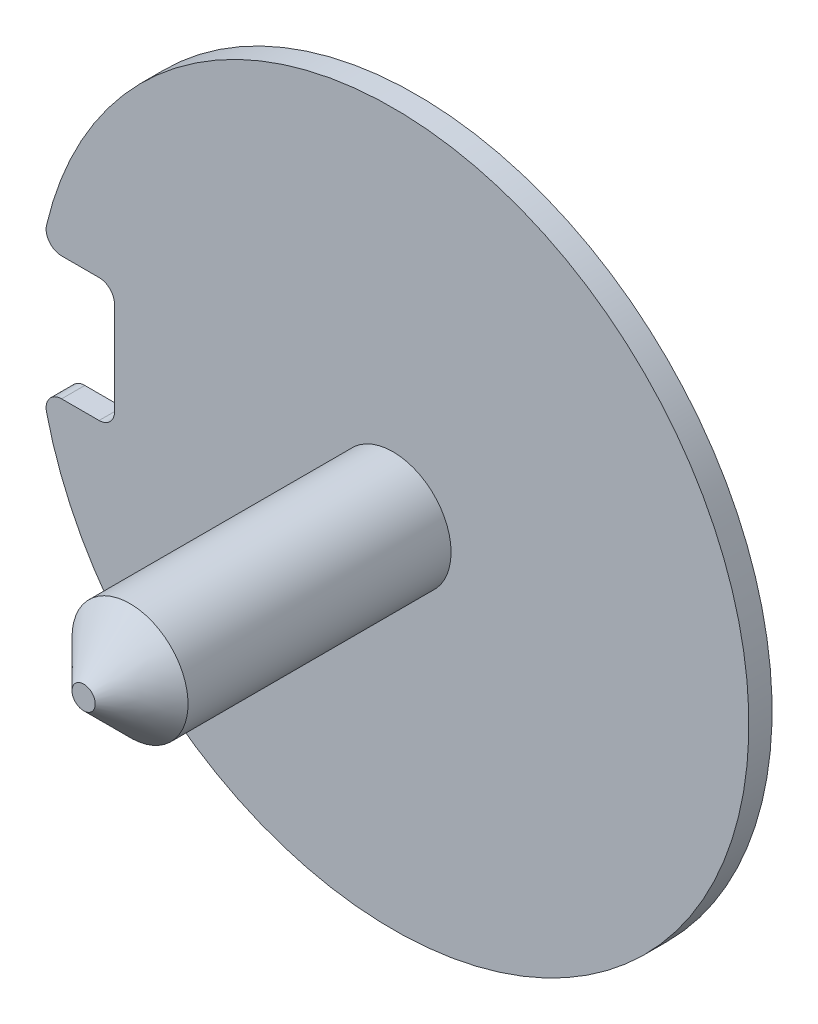
ISO-10303-21;
HEADER;
FILE_DESCRIPTION(('STEP AP214'),'2;1');
FILE_NAME('part.step','',(''),(''),'','','');
FILE_SCHEMA(('AUTOMOTIVE_DESIGN { 1 0 10303 214 1 1 1 1 }'));
ENDSEC;
DATA;
#1=APPLICATION_CONTEXT('core data for automotive mechanical design processes');
#2=APPLICATION_PROTOCOL_DEFINITION('international standard','automotive_design',2000,#1);
#3=PRODUCT_CONTEXT('',#1,'mechanical');
#4=PRODUCT('Part','Part','',(#3));
#5=PRODUCT_RELATED_PRODUCT_CATEGORY('part','',(#4));
#6=PRODUCT_DEFINITION_FORMATION('','',#4);
#7=PRODUCT_DEFINITION_CONTEXT('part definition',#1,'design');
#8=PRODUCT_DEFINITION('design','',#6,#7);
#9=PRODUCT_DEFINITION_SHAPE('','',#8);
#10=(LENGTH_UNIT() NAMED_UNIT(*) SI_UNIT(.MILLI.,.METRE.));
#11=(NAMED_UNIT(*) PLANE_ANGLE_UNIT() SI_UNIT($,.RADIAN.));
#12=(NAMED_UNIT(*) SI_UNIT($,.STERADIAN.) SOLID_ANGLE_UNIT());
#13=UNCERTAINTY_MEASURE_WITH_UNIT(LENGTH_MEASURE(1.E-05),#10,'distance_accuracy_value','');
#14=(GEOMETRIC_REPRESENTATION_CONTEXT(3) GLOBAL_UNCERTAINTY_ASSIGNED_CONTEXT((#13)) GLOBAL_UNIT_ASSIGNED_CONTEXT((#10,
#11,#12)) REPRESENTATION_CONTEXT('',''));
#15=CARTESIAN_POINT('',(0.,0.,0.));
#16=DIRECTION('',(0.,0.,1.));
#17=DIRECTION('',(1.,0.,0.));
#18=AXIS2_PLACEMENT_3D('',#15,#16,#17);
#19=CARTESIAN_POINT('',(0.,7.99999999999999,3.));
#20=DIRECTION('',(0.,0.,-1.));
#21=DIRECTION('',(-1.,0.,0.));
#22=AXIS2_PLACEMENT_3D('',#19,#20,#21);
#23=CYLINDRICAL_SURFACE('',#22,46.);
#24=CARTESIAN_POINT('',(0.,7.99999999999999,3.));
#25=DIRECTION('',(0.,0.,1.));
#26=DIRECTION('',(1.,0.,0.));
#27=AXIS2_PLACEMENT_3D('',#24,#25,#26);
#28=CIRCLE('',#27,46.);
#29=CARTESIAN_POINT('',(-44.7962328699506,-2.45454545454546,3.));
#30=VERTEX_POINT('',#29);
#31=CARTESIAN_POINT('',(-44.7962328699506,18.4545454545454,3.));
#32=VERTEX_POINT('',#31);
#33=EDGE_CURVE('E277',#30,#32,#28,.T.);
#34=ORIENTED_EDGE('',*,*,#33,.F.);
#35=DIRECTION('',(0.,0.,-1.));
#36=VECTOR('',#35,1.);
#37=CARTESIAN_POINT('',(-44.7962328699506,-2.45454545454546,3.));
#38=LINE('',#37,#36);
#39=CARTESIAN_POINT('',(-44.7962328699506,-2.45454545454546,0.));
#40=VERTEX_POINT('',#39);
#41=EDGE_CURVE('E67',#30,#40,#38,.T.);
#42=ORIENTED_EDGE('',*,*,#41,.T.);
#43=CARTESIAN_POINT('',(0.,7.99999999999999,0.));
#44=DIRECTION('',(0.,0.,1.));
#45=DIRECTION('',(1.,0.,0.));
#46=AXIS2_PLACEMENT_3D('',#43,#44,#45);
#47=CIRCLE('',#46,46.);
#48=CARTESIAN_POINT('',(-44.7962328699506,18.4545454545454,0.));
#49=VERTEX_POINT('',#48);
#50=EDGE_CURVE('E265',#40,#49,#47,.T.);
#51=ORIENTED_EDGE('',*,*,#50,.T.);
#52=DIRECTION('',(0.,0.,-1.));
#53=VECTOR('',#52,1.);
#54=CARTESIAN_POINT('',(-44.7962328699506,18.4545454545454,3.));
#55=LINE('',#54,#53);
#56=EDGE_CURVE('E319',#49,#32,#55,.F.);
#57=ORIENTED_EDGE('',*,*,#56,.T.);
#58=EDGE_LOOP('',(#34,#42,#51,#57));
#59=FACE_BOUND('',#58,.T.);
#60=ADVANCED_FACE('F44',(#59),#23,.T.);
#61=CARTESIAN_POINT('',(0.,7.99999999999999,3.));
#62=DIRECTION('',(0.,0.,1.));
#63=DIRECTION('',(1.,0.,0.));
#64=AXIS2_PLACEMENT_3D('',#61,#62,#63);
#65=PLANE('',#64);
#66=DIRECTION('',(-1.,0.,0.));
#67=VECTOR('',#66,1.);
#68=CARTESIAN_POINT('',(-36.,0.,3.));
#69=LINE('',#68,#67);
#70=CARTESIAN_POINT('',(-38.,0.,3.));
#71=VERTEX_POINT('',#70);
#72=CARTESIAN_POINT('',(-42.8485705712571,0.,3.));
#73=VERTEX_POINT('',#72);
#74=EDGE_CURVE('E361',#71,#73,#69,.T.);
#75=ORIENTED_EDGE('',*,*,#74,.T.);
#76=CARTESIAN_POINT('',(-42.8485705712571,-2.,3.));
#77=DIRECTION('',(0.,0.,1.));
#78=DIRECTION('',(1.,0.,0.));
#79=AXIS2_PLACEMENT_3D('',#76,#77,#78);
#80=CIRCLE('',#79,2.);
#81=EDGE_CURVE('E316',#73,#30,#80,.T.);
#82=ORIENTED_EDGE('',*,*,#81,.T.);
#83=ORIENTED_EDGE('',*,*,#33,.T.);
#84=CARTESIAN_POINT('',(-42.8485705712571,18.,3.));
#85=DIRECTION('',(0.,0.,1.));
#86=DIRECTION('',(1.,0.,0.));
#87=AXIS2_PLACEMENT_3D('',#84,#85,#86);
#88=CIRCLE('',#87,2.);
#89=CARTESIAN_POINT('',(-42.8485705712571,16.,3.));
#90=VERTEX_POINT('',#89);
#91=EDGE_CURVE('E313',#32,#90,#88,.T.);
#92=ORIENTED_EDGE('',*,*,#91,.T.);
#93=DIRECTION('',(1.,0.,0.));
#94=VECTOR('',#93,1.);
#95=CARTESIAN_POINT('',(-36.,16.,3.));
#96=LINE('',#95,#94);
#97=CARTESIAN_POINT('',(-38.,16.,3.));
#98=VERTEX_POINT('',#97);
#99=EDGE_CURVE('E231',#90,#98,#96,.T.);
#100=ORIENTED_EDGE('',*,*,#99,.T.);
#101=CARTESIAN_POINT('',(-38.,14.,3.));
#102=DIRECTION('',(0.,0.,1.));
#103=DIRECTION('',(1.,0.,0.));
#104=AXIS2_PLACEMENT_3D('',#101,#102,#103);
#105=CIRCLE('',#104,2.);
#106=CARTESIAN_POINT('',(-36.,14.,3.));
#107=VERTEX_POINT('',#106);
#108=EDGE_CURVE('E332',#98,#107,#105,.F.);
#109=ORIENTED_EDGE('',*,*,#108,.T.);
#110=DIRECTION('',(0.,-1.,0.));
#111=VECTOR('',#110,1.);
#112=CARTESIAN_POINT('',(-36.,16.,3.));
#113=LINE('',#112,#111);
#114=CARTESIAN_POINT('',(-36.,1.99999999999999,3.));
#115=VERTEX_POINT('',#114);
#116=EDGE_CURVE('E362',#107,#115,#113,.T.);
#117=ORIENTED_EDGE('',*,*,#116,.T.);
#118=CARTESIAN_POINT('',(-38.,2.,3.));
#119=DIRECTION('',(0.,0.,1.));
#120=DIRECTION('',(1.,0.,0.));
#121=AXIS2_PLACEMENT_3D('',#118,#119,#120);
#122=CIRCLE('',#121,2.);
#123=EDGE_CURVE('E11',#115,#71,#122,.F.);
#124=ORIENTED_EDGE('',*,*,#123,.T.);
#125=EDGE_LOOP('',(#75,#82,#83,#92,#100,#109,#117,#124));
#126=FACE_BOUND('',#125,.T.);
#127=CARTESIAN_POINT('',(0.,7.99999999999999,3.));
#128=DIRECTION('',(0.,0.,1.));
#129=DIRECTION('',(1.,0.,0.));
#130=AXIS2_PLACEMENT_3D('',#127,#128,#129);
#131=CIRCLE('',#130,7.5);
#132=CARTESIAN_POINT('',(7.50000000000001,7.99999999999999,3.));
#133=VERTEX_POINT('',#132);
#134=EDGE_CURVE('E192',#133,#133,#131,.T.);
#135=ORIENTED_EDGE('',*,*,#134,.F.);
#136=EDGE_LOOP('',(#135));
#137=FACE_BOUND('',#136,.T.);
#138=ADVANCED_FACE('F359',(#126,#137),#65,.T.);
#139=CARTESIAN_POINT('',(0.,7.99999999999999,0.));
#140=DIRECTION('',(0.,0.,1.));
#141=DIRECTION('',(1.,0.,0.));
#142=AXIS2_PLACEMENT_3D('',#139,#140,#141);
#143=PLANE('',#142);
#144=ORIENTED_EDGE('',*,*,#50,.F.);
#145=CARTESIAN_POINT('',(-42.8485705712571,-2.,0.));
#146=DIRECTION('',(0.,0.,1.));
#147=DIRECTION('',(1.,0.,0.));
#148=AXIS2_PLACEMENT_3D('',#145,#146,#147);
#149=CIRCLE('',#148,2.);
#150=CARTESIAN_POINT('',(-42.8485705712571,0.,0.));
#151=VERTEX_POINT('',#150);
#152=EDGE_CURVE('E326',#40,#151,#149,.F.);
#153=ORIENTED_EDGE('',*,*,#152,.T.);
#154=DIRECTION('',(-1.,0.,0.));
#155=VECTOR('',#154,1.);
#156=CARTESIAN_POINT('',(-36.,0.,0.));
#157=LINE('',#156,#155);
#158=CARTESIAN_POINT('',(-38.,0.,0.));
#159=VERTEX_POINT('',#158);
#160=EDGE_CURVE('E342',#159,#151,#157,.T.);
#161=ORIENTED_EDGE('',*,*,#160,.F.);
#162=CARTESIAN_POINT('',(-38.,2.,0.));
#163=DIRECTION('',(0.,0.,1.));
#164=DIRECTION('',(1.,0.,0.));
#165=AXIS2_PLACEMENT_3D('',#162,#163,#164);
#166=CIRCLE('',#165,2.);
#167=CARTESIAN_POINT('',(-36.,1.99999999999999,0.));
#168=VERTEX_POINT('',#167);
#169=EDGE_CURVE('E53',#159,#168,#166,.T.);
#170=ORIENTED_EDGE('',*,*,#169,.T.);
#171=DIRECTION('',(0.,-1.,0.));
#172=VECTOR('',#171,1.);
#173=CARTESIAN_POINT('',(-36.,16.,0.));
#174=LINE('',#173,#172);
#175=CARTESIAN_POINT('',(-36.,14.,0.));
#176=VERTEX_POINT('',#175);
#177=EDGE_CURVE('E340',#176,#168,#174,.T.);
#178=ORIENTED_EDGE('',*,*,#177,.F.);
#179=CARTESIAN_POINT('',(-38.,14.,0.));
#180=DIRECTION('',(0.,0.,1.));
#181=DIRECTION('',(1.,0.,0.));
#182=AXIS2_PLACEMENT_3D('',#179,#180,#181);
#183=CIRCLE('',#182,2.);
#184=CARTESIAN_POINT('',(-38.,16.,0.));
#185=VERTEX_POINT('',#184);
#186=EDGE_CURVE('E329',#176,#185,#183,.T.);
#187=ORIENTED_EDGE('',*,*,#186,.T.);
#188=DIRECTION('',(1.,0.,0.));
#189=VECTOR('',#188,1.);
#190=CARTESIAN_POINT('',(-36.,16.,0.));
#191=LINE('',#190,#189);
#192=CARTESIAN_POINT('',(-42.8485705712571,16.,0.));
#193=VERTEX_POINT('',#192);
#194=EDGE_CURVE('E352',#193,#185,#191,.T.);
#195=ORIENTED_EDGE('',*,*,#194,.F.);
#196=CARTESIAN_POINT('',(-42.8485705712571,18.,0.));
#197=DIRECTION('',(0.,0.,1.));
#198=DIRECTION('',(1.,0.,0.));
#199=AXIS2_PLACEMENT_3D('',#196,#197,#198);
#200=CIRCLE('',#199,2.);
#201=EDGE_CURVE('E60',#193,#49,#200,.F.);
#202=ORIENTED_EDGE('',*,*,#201,.T.);
#203=EDGE_LOOP('',(#144,#153,#161,#170,#178,#187,#195,#202));
#204=FACE_BOUND('',#203,.T.);
#205=DIRECTION('',(0.,-1.,0.));
#206=VECTOR('',#205,1.);
#207=CARTESIAN_POINT('',(10.05,9.04999999999999,0.));
#208=LINE('',#207,#206);
#209=CARTESIAN_POINT('',(10.05,9.04999999999999,0.));
#210=VERTEX_POINT('',#209);
#211=CARTESIAN_POINT('',(10.05,6.94999999999999,0.));
#212=VERTEX_POINT('',#211);
#213=EDGE_CURVE('E201',#210,#212,#208,.T.);
#214=ORIENTED_EDGE('',*,*,#213,.F.);
#215=CARTESIAN_POINT('',(9.00000000000001,9.04999999999999,0.));
#216=DIRECTION('',(0.,0.,-1.));
#217=DIRECTION('',(-1.,0.,0.));
#218=AXIS2_PLACEMENT_3D('',#215,#216,#217);
#219=CIRCLE('',#218,1.05);
#220=CARTESIAN_POINT('',(7.95000000000001,9.04999999999999,0.));
#221=VERTEX_POINT('',#220);
#222=EDGE_CURVE('E165',#221,#210,#219,.T.);
#223=ORIENTED_EDGE('',*,*,#222,.F.);
#224=DIRECTION('',(0.,1.,0.));
#225=VECTOR('',#224,1.);
#226=CARTESIAN_POINT('',(7.95000000000001,9.04999999999999,0.));
#227=LINE('',#226,#225);
#228=CARTESIAN_POINT('',(7.95000000000001,6.94999999999999,0.));
#229=VERTEX_POINT('',#228);
#230=EDGE_CURVE('E185',#229,#221,#227,.T.);
#231=ORIENTED_EDGE('',*,*,#230,.F.);
#232=CARTESIAN_POINT('',(9.00000000000001,6.94999999999999,0.));
#233=DIRECTION('',(0.,0.,-1.));
#234=DIRECTION('',(-1.,0.,0.));
#235=AXIS2_PLACEMENT_3D('',#232,#233,#234);
#236=CIRCLE('',#235,1.05);
#237=EDGE_CURVE('E189',#212,#229,#236,.T.);
#238=ORIENTED_EDGE('',*,*,#237,.F.);
#239=EDGE_LOOP('',(#214,#223,#231,#238));
#240=FACE_BOUND('',#239,.T.);
#241=DIRECTION('',(0.,-1.,0.));
#242=VECTOR('',#241,1.);
#243=CARTESIAN_POINT('',(-7.94999999999999,9.05,0.));
#244=LINE('',#243,#242);
#245=CARTESIAN_POINT('',(-7.94999999999999,9.05,0.));
#246=VERTEX_POINT('',#245);
#247=CARTESIAN_POINT('',(-7.94999999999999,6.95,0.));
#248=VERTEX_POINT('',#247);
#249=EDGE_CURVE('E241',#246,#248,#244,.T.);
#250=ORIENTED_EDGE('',*,*,#249,.F.);
#251=CARTESIAN_POINT('',(-8.99999999999999,9.05,0.));
#252=DIRECTION('',(0.,0.,-1.));
#253=DIRECTION('',(1.,0.,0.));
#254=AXIS2_PLACEMENT_3D('',#251,#252,#253);
#255=CIRCLE('',#254,1.05);
#256=CARTESIAN_POINT('',(-10.05,9.05,0.));
#257=VERTEX_POINT('',#256);
#258=EDGE_CURVE('E202',#257,#246,#255,.T.);
#259=ORIENTED_EDGE('',*,*,#258,.F.);
#260=DIRECTION('',(0.,1.,0.));
#261=VECTOR('',#260,1.);
#262=CARTESIAN_POINT('',(-10.05,9.05,0.));
#263=LINE('',#262,#261);
#264=CARTESIAN_POINT('',(-10.05,6.95,0.));
#265=VERTEX_POINT('',#264);
#266=EDGE_CURVE('E232',#265,#257,#263,.T.);
#267=ORIENTED_EDGE('',*,*,#266,.F.);
#268=CARTESIAN_POINT('',(-8.99999999999999,6.95,0.));
#269=DIRECTION('',(0.,0.,-1.));
#270=DIRECTION('',(1.,0.,0.));
#271=AXIS2_PLACEMENT_3D('',#268,#269,#270);
#272=CIRCLE('',#271,1.05);
#273=EDGE_CURVE('E236',#248,#265,#272,.T.);
#274=ORIENTED_EDGE('',*,*,#273,.F.);
#275=EDGE_LOOP('',(#250,#259,#267,#274));
#276=FACE_BOUND('',#275,.T.);
#277=CARTESIAN_POINT('',(0.,0.,0.));
#278=DIRECTION('',(0.,0.,-1.));
#279=DIRECTION('',(-1.,0.,0.));
#280=AXIS2_PLACEMENT_3D('',#277,#278,#279);
#281=CIRCLE('',#280,3.05);
#282=CARTESIAN_POINT('',(-3.05,0.,0.));
#283=VERTEX_POINT('',#282);
#284=EDGE_CURVE('E266',#283,#283,#281,.T.);
#285=ORIENTED_EDGE('',*,*,#284,.F.);
#286=EDGE_LOOP('',(#285));
#287=FACE_BOUND('',#286,.T.);
#288=CARTESIAN_POINT('',(0.,16.,0.));
#289=DIRECTION('',(0.,0.,-1.));
#290=DIRECTION('',(1.,0.,0.));
#291=AXIS2_PLACEMENT_3D('',#288,#289,#290);
#292=CIRCLE('',#291,3.05);
#293=CARTESIAN_POINT('',(3.05,16.,0.));
#294=VERTEX_POINT('',#293);
#295=EDGE_CURVE('E270',#294,#294,#292,.T.);
#296=ORIENTED_EDGE('',*,*,#295,.F.);
#297=EDGE_LOOP('',(#296));
#298=FACE_BOUND('',#297,.T.);
#299=ADVANCED_FACE('F338',(#204,#240,#276,#287,#298),#143,.F.);
#300=CARTESIAN_POINT('',(0.,16.,1.1));
#301=DIRECTION('',(0.,0.,-1.));
#302=DIRECTION('',(-1.,0.,0.));
#303=AXIS2_PLACEMENT_3D('',#300,#301,#302);
#304=CYLINDRICAL_SURFACE('',#303,3.05);
#305=CARTESIAN_POINT('',(0.,16.,1.1));
#306=DIRECTION('',(0.,0.,-1.));
#307=DIRECTION('',(1.,0.,0.));
#308=AXIS2_PLACEMENT_3D('',#305,#306,#307);
#309=CIRCLE('',#308,3.05);
#310=CARTESIAN_POINT('',(3.05,16.,1.1));
#311=VERTEX_POINT('',#310);
#312=EDGE_CURVE('E211',#311,#311,#309,.T.);
#313=ORIENTED_EDGE('',*,*,#312,.F.);
#314=EDGE_LOOP('',(#313));
#315=FACE_BOUND('',#314,.T.);
#316=ORIENTED_EDGE('',*,*,#295,.T.);
#317=EDGE_LOOP('',(#316));
#318=FACE_BOUND('',#317,.T.);
#319=ADVANCED_FACE('F474',(#315,#318),#304,.F.);
#320=CARTESIAN_POINT('',(0.,16.,1.1));
#321=DIRECTION('',(0.,0.,1.));
#322=DIRECTION('',(1.,0.,0.));
#323=AXIS2_PLACEMENT_3D('',#320,#321,#322);
#324=PLANE('',#323);
#325=ORIENTED_EDGE('',*,*,#312,.T.);
#326=EDGE_LOOP('',(#325));
#327=FACE_BOUND('',#326,.T.);
#328=ADVANCED_FACE('F472',(#327),#324,.F.);
#329=CARTESIAN_POINT('',(0.,0.,1.1));
#330=DIRECTION('',(0.,0.,-1.));
#331=DIRECTION('',(-1.,0.,0.));
#332=AXIS2_PLACEMENT_3D('',#329,#330,#331);
#333=CYLINDRICAL_SURFACE('',#332,3.05);
#334=CARTESIAN_POINT('',(0.,0.,1.1));
#335=DIRECTION('',(0.,0.,-1.));
#336=DIRECTION('',(-1.,0.,0.));
#337=AXIS2_PLACEMENT_3D('',#334,#335,#336);
#338=CIRCLE('',#337,3.05);
#339=CARTESIAN_POINT('',(-3.05,0.,1.1));
#340=VERTEX_POINT('',#339);
#341=EDGE_CURVE('E261',#340,#340,#338,.T.);
#342=ORIENTED_EDGE('',*,*,#341,.F.);
#343=EDGE_LOOP('',(#342));
#344=FACE_BOUND('',#343,.T.);
#345=ORIENTED_EDGE('',*,*,#284,.T.);
#346=EDGE_LOOP('',(#345));
#347=FACE_BOUND('',#346,.T.);
#348=ADVANCED_FACE('F468',(#344,#347),#333,.F.);
#349=CARTESIAN_POINT('',(0.,0.,1.1));
#350=DIRECTION('',(0.,0.,-1.));
#351=DIRECTION('',(-1.,0.,0.));
#352=AXIS2_PLACEMENT_3D('',#349,#350,#351);
#353=PLANE('',#352);
#354=ORIENTED_EDGE('',*,*,#341,.T.);
#355=EDGE_LOOP('',(#354));
#356=FACE_BOUND('',#355,.T.);
#357=ADVANCED_FACE('F450',(#356),#353,.T.);
#358=CARTESIAN_POINT('',(-8.99999999999999,9.05,2.2));
#359=DIRECTION('',(0.,0.,-1.));
#360=DIRECTION('',(-1.,0.,0.));
#361=AXIS2_PLACEMENT_3D('',#358,#359,#360);
#362=CYLINDRICAL_SURFACE('',#361,1.05);
#363=ORIENTED_EDGE('',*,*,#258,.T.);
#364=DIRECTION('',(0.,0.,-1.));
#365=VECTOR('',#364,1.);
#366=CARTESIAN_POINT('',(-7.94999999999999,9.05,2.2));
#367=LINE('',#366,#365);
#368=CARTESIAN_POINT('',(-7.94999999999999,9.05,2.2));
#369=VERTEX_POINT('',#368);
#370=EDGE_CURVE('E217',#369,#246,#367,.T.);
#371=ORIENTED_EDGE('',*,*,#370,.F.);
#372=CARTESIAN_POINT('',(-8.99999999999999,9.05,2.2));
#373=DIRECTION('',(0.,0.,-1.));
#374=DIRECTION('',(1.,0.,0.));
#375=AXIS2_PLACEMENT_3D('',#372,#373,#374);
#376=CIRCLE('',#375,1.05);
#377=CARTESIAN_POINT('',(-10.05,9.05,2.2));
#378=VERTEX_POINT('',#377);
#379=EDGE_CURVE('E237',#378,#369,#376,.T.);
#380=ORIENTED_EDGE('',*,*,#379,.F.);
#381=DIRECTION('',(0.,0.,-1.));
#382=VECTOR('',#381,1.);
#383=CARTESIAN_POINT('',(-10.05,9.05,2.2));
#384=LINE('',#383,#382);
#385=EDGE_CURVE('E228',#378,#257,#384,.T.);
#386=ORIENTED_EDGE('',*,*,#385,.T.);
#387=EDGE_LOOP('',(#363,#371,#380,#386));
#388=FACE_BOUND('',#387,.T.);
#389=ADVANCED_FACE('F446',(#388),#362,.F.);
#390=CARTESIAN_POINT('',(-10.05,9.05,2.2));
#391=DIRECTION('',(-1.,0.,0.));
#392=DIRECTION('',(0.,0.,1.));
#393=AXIS2_PLACEMENT_3D('',#390,#391,#392);
#394=PLANE('',#393);
#395=ORIENTED_EDGE('',*,*,#266,.T.);
#396=ORIENTED_EDGE('',*,*,#385,.F.);
#397=DIRECTION('',(0.,1.,0.));
#398=VECTOR('',#397,1.);
#399=CARTESIAN_POINT('',(-10.05,9.05,2.2));
#400=LINE('',#399,#398);
#401=CARTESIAN_POINT('',(-10.05,6.95,2.2));
#402=VERTEX_POINT('',#401);
#403=EDGE_CURVE('E221',#402,#378,#400,.T.);
#404=ORIENTED_EDGE('',*,*,#403,.F.);
#405=DIRECTION('',(0.,0.,-1.));
#406=VECTOR('',#405,1.);
#407=CARTESIAN_POINT('',(-10.05,6.95,2.2));
#408=LINE('',#407,#406);
#409=EDGE_CURVE('E225',#402,#265,#408,.T.);
#410=ORIENTED_EDGE('',*,*,#409,.T.);
#411=EDGE_LOOP('',(#395,#396,#404,#410));
#412=FACE_BOUND('',#411,.T.);
#413=ADVANCED_FACE('F449',(#412),#394,.F.);
#414=CARTESIAN_POINT('',(-8.99999999999999,6.95,2.2));
#415=DIRECTION('',(0.,0.,-1.));
#416=DIRECTION('',(-1.,0.,0.));
#417=AXIS2_PLACEMENT_3D('',#414,#415,#416);
#418=CYLINDRICAL_SURFACE('',#417,1.05);
#419=ORIENTED_EDGE('',*,*,#273,.T.);
#420=ORIENTED_EDGE('',*,*,#409,.F.);
#421=CARTESIAN_POINT('',(-8.99999999999999,6.95,2.2));
#422=DIRECTION('',(0.,0.,-1.));
#423=DIRECTION('',(1.,0.,0.));
#424=AXIS2_PLACEMENT_3D('',#421,#422,#423);
#425=CIRCLE('',#424,1.05);
#426=CARTESIAN_POINT('',(-7.94999999999999,6.95,2.2));
#427=VERTEX_POINT('',#426);
#428=EDGE_CURVE('E250',#427,#402,#425,.T.);
#429=ORIENTED_EDGE('',*,*,#428,.F.);
#430=DIRECTION('',(0.,0.,-1.));
#431=VECTOR('',#430,1.);
#432=CARTESIAN_POINT('',(-7.94999999999999,6.95,2.2));
#433=LINE('',#432,#431);
#434=EDGE_CURVE('E222',#427,#248,#433,.T.);
#435=ORIENTED_EDGE('',*,*,#434,.T.);
#436=EDGE_LOOP('',(#419,#420,#429,#435));
#437=FACE_BOUND('',#436,.T.);
#438=ADVANCED_FACE('F455',(#437),#418,.F.);
#439=CARTESIAN_POINT('',(-7.94999999999999,9.05,2.2));
#440=DIRECTION('',(1.,0.,0.));
#441=DIRECTION('',(0.,0.,-1.));
#442=AXIS2_PLACEMENT_3D('',#439,#440,#441);
#443=PLANE('',#442);
#444=ORIENTED_EDGE('',*,*,#249,.T.);
#445=ORIENTED_EDGE('',*,*,#434,.F.);
#446=DIRECTION('',(0.,-1.,0.));
#447=VECTOR('',#446,1.);
#448=CARTESIAN_POINT('',(-7.94999999999999,9.05,2.2));
#449=LINE('',#448,#447);
#450=EDGE_CURVE('E254',#369,#427,#449,.T.);
#451=ORIENTED_EDGE('',*,*,#450,.F.);
#452=ORIENTED_EDGE('',*,*,#370,.T.);
#453=EDGE_LOOP('',(#444,#445,#451,#452));
#454=FACE_BOUND('',#453,.T.);
#455=ADVANCED_FACE('F452',(#454),#443,.F.);
#456=CARTESIAN_POINT('',(-8.99999999999999,9.05,2.2));
#457=DIRECTION('',(0.,0.,1.));
#458=DIRECTION('',(1.,0.,0.));
#459=AXIS2_PLACEMENT_3D('',#456,#457,#458);
#460=PLANE('',#459);
#461=ORIENTED_EDGE('',*,*,#379,.T.);
#462=ORIENTED_EDGE('',*,*,#450,.T.);
#463=ORIENTED_EDGE('',*,*,#428,.T.);
#464=ORIENTED_EDGE('',*,*,#403,.T.);
#465=EDGE_LOOP('',(#461,#462,#463,#464));
#466=FACE_BOUND('',#465,.T.);
#467=ADVANCED_FACE('F445',(#466),#460,.F.);
#468=CARTESIAN_POINT('',(9.00000000000001,9.04999999999999,2.2));
#469=DIRECTION('',(0.,0.,-1.));
#470=DIRECTION('',(-1.,0.,0.));
#471=AXIS2_PLACEMENT_3D('',#468,#469,#470);
#472=CYLINDRICAL_SURFACE('',#471,1.05);
#473=ORIENTED_EDGE('',*,*,#222,.T.);
#474=DIRECTION('',(0.,0.,-1.));
#475=VECTOR('',#474,1.);
#476=CARTESIAN_POINT('',(10.05,9.04999999999999,2.2));
#477=LINE('',#476,#475);
#478=CARTESIAN_POINT('',(10.05,9.04999999999999,2.2));
#479=VERTEX_POINT('',#478);
#480=EDGE_CURVE('E158',#479,#210,#477,.T.);
#481=ORIENTED_EDGE('',*,*,#480,.F.);
#482=CARTESIAN_POINT('',(9.00000000000001,9.04999999999999,2.2));
#483=DIRECTION('',(0.,0.,-1.));
#484=DIRECTION('',(-1.,0.,0.));
#485=AXIS2_PLACEMENT_3D('',#482,#483,#484);
#486=CIRCLE('',#485,1.05);
#487=CARTESIAN_POINT('',(7.95000000000001,9.04999999999999,2.2));
#488=VERTEX_POINT('',#487);
#489=EDGE_CURVE('E162',#488,#479,#486,.T.);
#490=ORIENTED_EDGE('',*,*,#489,.F.);
#491=DIRECTION('',(0.,0.,-1.));
#492=VECTOR('',#491,1.);
#493=CARTESIAN_POINT('',(7.95000000000001,9.04999999999999,2.2));
#494=LINE('',#493,#492);
#495=EDGE_CURVE('E208',#488,#221,#494,.T.);
#496=ORIENTED_EDGE('',*,*,#495,.T.);
#497=EDGE_LOOP('',(#473,#481,#490,#496));
#498=FACE_BOUND('',#497,.T.);
#499=ADVANCED_FACE('F160',(#498),#472,.F.);
#500=CARTESIAN_POINT('',(7.95000000000001,9.04999999999999,2.2));
#501=DIRECTION('',(-1.,0.,0.));
#502=DIRECTION('',(0.,0.,1.));
#503=AXIS2_PLACEMENT_3D('',#500,#501,#502);
#504=PLANE('',#503);
#505=ORIENTED_EDGE('',*,*,#230,.T.);
#506=ORIENTED_EDGE('',*,*,#495,.F.);
#507=DIRECTION('',(0.,1.,0.));
#508=VECTOR('',#507,1.);
#509=CARTESIAN_POINT('',(7.95000000000001,9.04999999999999,2.2));
#510=LINE('',#509,#508);
#511=CARTESIAN_POINT('',(7.95000000000001,6.94999999999999,2.2));
#512=VERTEX_POINT('',#511);
#513=EDGE_CURVE('E171',#512,#488,#510,.T.);
#514=ORIENTED_EDGE('',*,*,#513,.F.);
#515=DIRECTION('',(0.,0.,-1.));
#516=VECTOR('',#515,1.);
#517=CARTESIAN_POINT('',(7.95000000000001,6.94999999999999,2.2));
#518=LINE('',#517,#516);
#519=EDGE_CURVE('E212',#512,#229,#518,.T.);
#520=ORIENTED_EDGE('',*,*,#519,.T.);
#521=EDGE_LOOP('',(#505,#506,#514,#520));
#522=FACE_BOUND('',#521,.T.);
#523=ADVANCED_FACE('F433',(#522),#504,.F.);
#524=CARTESIAN_POINT('',(9.00000000000001,6.94999999999999,2.2));
#525=DIRECTION('',(0.,0.,-1.));
#526=DIRECTION('',(-1.,0.,0.));
#527=AXIS2_PLACEMENT_3D('',#524,#525,#526);
#528=CYLINDRICAL_SURFACE('',#527,1.05);
#529=ORIENTED_EDGE('',*,*,#237,.T.);
#530=ORIENTED_EDGE('',*,*,#519,.F.);
#531=CARTESIAN_POINT('',(9.00000000000001,6.94999999999999,2.2));
#532=DIRECTION('',(0.,0.,-1.));
#533=DIRECTION('',(-1.,0.,0.));
#534=AXIS2_PLACEMENT_3D('',#531,#532,#533);
#535=CIRCLE('',#534,1.05);
#536=CARTESIAN_POINT('',(10.05,6.94999999999999,2.2));
#537=VERTEX_POINT('',#536);
#538=EDGE_CURVE('E180',#537,#512,#535,.T.);
#539=ORIENTED_EDGE('',*,*,#538,.F.);
#540=DIRECTION('',(0.,0.,-1.));
#541=VECTOR('',#540,1.);
#542=CARTESIAN_POINT('',(10.05,6.94999999999999,2.2));
#543=LINE('',#542,#541);
#544=EDGE_CURVE('E170',#537,#212,#543,.T.);
#545=ORIENTED_EDGE('',*,*,#544,.T.);
#546=EDGE_LOOP('',(#529,#530,#539,#545));
#547=FACE_BOUND('',#546,.T.);
#548=ADVANCED_FACE('F436',(#547),#528,.F.);
#549=CARTESIAN_POINT('',(10.05,9.04999999999999,2.2));
#550=DIRECTION('',(1.,0.,0.));
#551=DIRECTION('',(0.,0.,-1.));
#552=AXIS2_PLACEMENT_3D('',#549,#550,#551);
#553=PLANE('',#552);
#554=ORIENTED_EDGE('',*,*,#213,.T.);
#555=ORIENTED_EDGE('',*,*,#544,.F.);
#556=DIRECTION('',(0.,-1.,0.));
#557=VECTOR('',#556,1.);
#558=CARTESIAN_POINT('',(10.05,9.04999999999999,2.2));
#559=LINE('',#558,#557);
#560=EDGE_CURVE('E174',#479,#537,#559,.T.);
#561=ORIENTED_EDGE('',*,*,#560,.F.);
#562=ORIENTED_EDGE('',*,*,#480,.T.);
#563=EDGE_LOOP('',(#554,#555,#561,#562));
#564=FACE_BOUND('',#563,.T.);
#565=ADVANCED_FACE('F175',(#564),#553,.F.);
#566=CARTESIAN_POINT('',(9.00000000000001,9.04999999999999,2.2));
#567=DIRECTION('',(0.,0.,-1.));
#568=DIRECTION('',(-1.,0.,0.));
#569=AXIS2_PLACEMENT_3D('',#566,#567,#568);
#570=PLANE('',#569);
#571=ORIENTED_EDGE('',*,*,#489,.T.);
#572=ORIENTED_EDGE('',*,*,#560,.T.);
#573=ORIENTED_EDGE('',*,*,#538,.T.);
#574=ORIENTED_EDGE('',*,*,#513,.T.);
#575=EDGE_LOOP('',(#571,#572,#573,#574));
#576=FACE_BOUND('',#575,.T.);
#577=ADVANCED_FACE('F182',(#576),#570,.T.);
#578=CARTESIAN_POINT('',(0.,7.99999999999999,43.));
#579=DIRECTION('',(0.,0.,-1.));
#580=DIRECTION('',(-1.,0.,0.));
#581=AXIS2_PLACEMENT_3D('',#578,#579,#580);
#582=CYLINDRICAL_SURFACE('',#581,7.5);
#583=CARTESIAN_POINT('',(0.,7.99999999999999,37.));
#584=DIRECTION('',(0.,0.,1.));
#585=DIRECTION('',(1.,0.,0.));
#586=AXIS2_PLACEMENT_3D('',#583,#584,#585);
#587=CIRCLE('',#586,7.5);
#588=CARTESIAN_POINT('',(-7.49999999999999,7.99999999999999,37.));
#589=VERTEX_POINT('',#588);
#590=EDGE_CURVE('E287',#589,#589,#587,.F.);
#591=ORIENTED_EDGE('',*,*,#590,.T.);
#592=EDGE_LOOP('',(#591));
#593=FACE_BOUND('',#592,.T.);
#594=ORIENTED_EDGE('',*,*,#134,.T.);
#595=EDGE_LOOP('',(#594));
#596=FACE_BOUND('',#595,.T.);
#597=ADVANCED_FACE('F426',(#593,#596),#582,.T.);
#598=CARTESIAN_POINT('',(0.,7.99999999999999,43.));
#599=DIRECTION('',(0.,0.,1.));
#600=DIRECTION('',(1.,0.,0.));
#601=AXIS2_PLACEMENT_3D('',#598,#599,#600);
#602=PLANE('',#601);
#603=CARTESIAN_POINT('',(0.,7.99999999999999,43.));
#604=DIRECTION('',(0.,0.,1.));
#605=DIRECTION('',(1.,0.,0.));
#606=AXIS2_PLACEMENT_3D('',#603,#604,#605);
#607=CIRCLE('',#606,1.50000000000004);
#608=CARTESIAN_POINT('',(-1.50000000000003,7.99999999999999,43.));
#609=VERTEX_POINT('',#608);
#610=EDGE_CURVE('E283',#609,#609,#607,.T.);
#611=ORIENTED_EDGE('',*,*,#610,.T.);
#612=EDGE_LOOP('',(#611));
#613=FACE_BOUND('',#612,.T.);
#614=ADVANCED_FACE('F411',(#613),#602,.T.);
#615=CARTESIAN_POINT('',(0.,7.99999999999999,43.));
#616=DIRECTION('',(0.,0.,-1.));
#617=DIRECTION('',(-1.,0.,0.));
#618=AXIS2_PLACEMENT_3D('',#615,#616,#617);
#619=CONICAL_SURFACE('',#618,1.50000000000004,0.785398163397446);
#620=CARTESIAN_POINT('',(-7.49999999999999,7.99999999999999,37.));
#621=CARTESIAN_POINT('',(-7.43749999999999,7.99999999999999,37.0625));
#622=CARTESIAN_POINT('',(-7.37499999999999,7.99999999999999,37.125));
#623=CARTESIAN_POINT('',(-7.24999999999999,7.99999999999999,37.25));
#624=CARTESIAN_POINT('',(-7.18749999999999,7.99999999999999,37.3125));
#625=CARTESIAN_POINT('',(-7.06249999999999,7.99999999999999,37.4375));
#626=CARTESIAN_POINT('',(-6.99999999999999,7.99999999999999,37.5));
#627=CARTESIAN_POINT('',(-6.87499999999999,7.99999999999999,37.625));
#628=CARTESIAN_POINT('',(-6.81249999999999,7.99999999999999,37.6875));
#629=CARTESIAN_POINT('',(-6.6875,7.99999999999999,37.8125));
#630=CARTESIAN_POINT('',(-6.625,7.99999999999999,37.875));
#631=CARTESIAN_POINT('',(-6.5,7.99999999999999,38.));
#632=CARTESIAN_POINT('',(-6.4375,7.99999999999999,38.0625));
#633=CARTESIAN_POINT('',(-6.3125,7.99999999999999,38.1875));
#634=CARTESIAN_POINT('',(-6.25,7.99999999999999,38.25));
#635=CARTESIAN_POINT('',(-6.125,7.99999999999999,38.375));
#636=CARTESIAN_POINT('',(-6.0625,7.99999999999999,38.4375));
#637=CARTESIAN_POINT('',(-5.9375,7.99999999999999,38.5625));
#638=CARTESIAN_POINT('',(-5.875,7.99999999999999,38.625));
#639=CARTESIAN_POINT('',(-5.75,7.99999999999999,38.75));
#640=CARTESIAN_POINT('',(-5.6875,7.99999999999999,38.8125));
#641=CARTESIAN_POINT('',(-5.5625,7.99999999999999,38.9375));
#642=CARTESIAN_POINT('',(-5.5,7.99999999999999,39.));
#643=CARTESIAN_POINT('',(-5.37500000000001,7.99999999999999,39.125));
#644=CARTESIAN_POINT('',(-5.31250000000001,7.99999999999999,39.1875));
#645=CARTESIAN_POINT('',(-5.18750000000001,7.99999999999999,39.3125));
#646=CARTESIAN_POINT('',(-5.12500000000001,7.99999999999999,39.375));
#647=CARTESIAN_POINT('',(-5.00000000000001,7.99999999999999,39.5));
#648=CARTESIAN_POINT('',(-4.93750000000001,7.99999999999999,39.5625));
#649=CARTESIAN_POINT('',(-4.81250000000001,7.99999999999999,39.6875));
#650=CARTESIAN_POINT('',(-4.75000000000001,7.99999999999999,39.75));
#651=CARTESIAN_POINT('',(-4.62500000000001,7.99999999999999,39.875));
#652=CARTESIAN_POINT('',(-4.56250000000001,7.99999999999999,39.9375));
#653=CARTESIAN_POINT('',(-4.43750000000001,7.99999999999999,40.0625));
#654=CARTESIAN_POINT('',(-4.37500000000001,7.99999999999999,40.125));
#655=CARTESIAN_POINT('',(-4.25000000000001,7.99999999999999,40.25));
#656=CARTESIAN_POINT('',(-4.18750000000001,7.99999999999999,40.3125));
#657=CARTESIAN_POINT('',(-4.06250000000001,7.99999999999999,40.4375));
#658=CARTESIAN_POINT('',(-4.00000000000002,7.99999999999999,40.5));
#659=CARTESIAN_POINT('',(-3.87500000000002,7.99999999999999,40.625));
#660=CARTESIAN_POINT('',(-3.81250000000002,7.99999999999999,40.6875));
#661=CARTESIAN_POINT('',(-3.68750000000002,7.99999999999999,40.8125));
#662=CARTESIAN_POINT('',(-3.62500000000002,7.99999999999999,40.875));
#663=CARTESIAN_POINT('',(-3.50000000000002,7.99999999999999,41.));
#664=CARTESIAN_POINT('',(-3.43750000000002,7.99999999999999,41.0625));
#665=CARTESIAN_POINT('',(-3.31250000000002,7.99999999999999,41.1875));
#666=CARTESIAN_POINT('',(-3.25000000000002,7.99999999999999,41.25));
#667=CARTESIAN_POINT('',(-3.12500000000002,7.99999999999999,41.375));
#668=CARTESIAN_POINT('',(-3.06250000000002,7.99999999999999,41.4375));
#669=CARTESIAN_POINT('',(-2.93750000000002,7.99999999999999,41.5625));
#670=CARTESIAN_POINT('',(-2.87500000000002,7.99999999999999,41.625));
#671=CARTESIAN_POINT('',(-2.75000000000002,7.99999999999999,41.75));
#672=CARTESIAN_POINT('',(-2.68750000000002,7.99999999999999,41.8125));
#673=CARTESIAN_POINT('',(-2.56250000000002,7.99999999999999,41.9375));
#674=CARTESIAN_POINT('',(-2.50000000000003,7.99999999999999,42.));
#675=CARTESIAN_POINT('',(-2.37500000000003,7.99999999999999,42.125));
#676=CARTESIAN_POINT('',(-2.31250000000003,7.99999999999999,42.1875));
#677=CARTESIAN_POINT('',(-2.18750000000003,7.99999999999999,42.3125));
#678=CARTESIAN_POINT('',(-2.12500000000003,7.99999999999999,42.375));
#679=CARTESIAN_POINT('',(-2.00000000000003,7.99999999999999,42.5));
#680=CARTESIAN_POINT('',(-1.93750000000003,7.99999999999999,42.5625));
#681=CARTESIAN_POINT('',(-1.81250000000003,7.99999999999999,42.6875));
#682=CARTESIAN_POINT('',(-1.75000000000003,7.99999999999999,42.75));
#683=CARTESIAN_POINT('',(-1.62500000000003,7.99999999999999,42.875));
#684=CARTESIAN_POINT('',(-1.56250000000003,7.99999999999999,42.9375));
#685=CARTESIAN_POINT('',(-1.50000000000003,7.99999999999999,43.));
#686=B_SPLINE_CURVE_WITH_KNOTS('',3,(#620,#621,#622,#623,#624,#625,#626,#627,#628,#629,#630,
#631,#632,#633,#634,#635,#636,#637,#638,#639,#640,#641,#642,#643,#644,#645,#646,#647,#648,#649,
#650,#651,#652,#653,#654,#655,#656,#657,#658,#659,#660,#661,#662,#663,#664,#665,#666,#667,#668,
#669,#670,#671,#672,#673,#674,#675,#676,#677,#678,#679,#680,#681,#682,#683,#684,#685),
.UNSPECIFIED.,.F.,.F.,(4,2,2,2,2,2,2,2,2,2,2,2,2,2,2,2,2,2,2,2,2,2,2,2,2,2,2,2,2,2,2,2,4),(0.,
0.265165042944955,0.53033008588991,0.795495128834864,1.06066017177982,1.32582521472477,
1.59099025766973,1.85615530061468,2.12132034355964,2.38648538650459,2.65165042944954,
2.9168154723945,3.18198051533945,3.4471455582844,3.71231060122936,3.97747564417431,
4.24264068711927,4.50780573006422,4.77297077300918,5.03813581595413,5.30330085889909,
5.56846590184404,5.83363094478899,6.09879598773395,6.3639610306789,6.62912607362385,
6.89429111656881,7.15945615951376,7.42462120245872,7.68978624540367,7.95495128834863,
8.22011633129358,8.48528137423854),.UNSPECIFIED.);
#687=EDGE_CURVE('BSEAM406',#589,#609,#686,.T.);
#688=ORIENTED_EDGE('',*,*,#590,.F.);
#689=ORIENTED_EDGE('',*,*,#610,.F.);
#690=ORIENTED_EDGE('',*,*,#687,.T.);
#691=ORIENTED_EDGE('',*,*,#687,.F.);
#692=EDGE_LOOP('',(#688,#690,#689,#691));
#693=FACE_BOUND('',#692,.T.);
#694=ADVANCED_FACE('F406',(#693),#619,.T.);
#695=CARTESIAN_POINT('',(-36.,0.,43.001));
#696=DIRECTION('',(0.,-1.,0.));
#697=DIRECTION('',(0.,0.,-1.));
#698=AXIS2_PLACEMENT_3D('',#695,#696,#697);
#699=PLANE('',#698);
#700=ORIENTED_EDGE('',*,*,#74,.F.);
#701=DIRECTION('',(0.,0.,-1.));
#702=VECTOR('',#701,1.);
#703=CARTESIAN_POINT('',(-38.,0.,0.));
#704=LINE('',#703,#702);
#705=EDGE_CURVE('E309',#71,#159,#704,.T.);
#706=ORIENTED_EDGE('',*,*,#705,.T.);
#707=ORIENTED_EDGE('',*,*,#160,.T.);
#708=DIRECTION('',(0.,0.,-1.));
#709=VECTOR('',#708,1.);
#710=CARTESIAN_POINT('',(-42.8485705712571,0.,43.001));
#711=LINE('',#710,#709);
#712=EDGE_CURVE('E305',#151,#73,#711,.F.);
#713=ORIENTED_EDGE('',*,*,#712,.T.);
#714=EDGE_LOOP('',(#700,#706,#707,#713));
#715=FACE_BOUND('',#714,.T.);
#716=ADVANCED_FACE('F364',(#715),#699,.F.);
#717=CARTESIAN_POINT('',(-36.,16.,43.001));
#718=DIRECTION('',(0.,1.,0.));
#719=DIRECTION('',(-1.,0.,0.));
#720=AXIS2_PLACEMENT_3D('',#717,#718,#719);
#721=PLANE('',#720);
#722=ORIENTED_EDGE('',*,*,#194,.T.);
#723=DIRECTION('',(0.,0.,-1.));
#724=VECTOR('',#723,1.);
#725=CARTESIAN_POINT('',(-38.,16.,3.));
#726=LINE('',#725,#724);
#727=EDGE_CURVE('E302',#185,#98,#726,.F.);
#728=ORIENTED_EDGE('',*,*,#727,.T.);
#729=ORIENTED_EDGE('',*,*,#99,.F.);
#730=DIRECTION('',(0.,0.,-1.));
#731=VECTOR('',#730,1.);
#732=CARTESIAN_POINT('',(-42.8485705712571,16.,43.001));
#733=LINE('',#732,#731);
#734=EDGE_CURVE('E298',#90,#193,#733,.T.);
#735=ORIENTED_EDGE('',*,*,#734,.T.);
#736=EDGE_LOOP('',(#722,#728,#729,#735));
#737=FACE_BOUND('',#736,.T.);
#738=ADVANCED_FACE('F385',(#737),#721,.F.);
#739=CARTESIAN_POINT('',(-36.,16.,43.001));
#740=DIRECTION('',(1.,0.,0.));
#741=DIRECTION('',(0.,1.,0.));
#742=AXIS2_PLACEMENT_3D('',#739,#740,#741);
#743=PLANE('',#742);
#744=ORIENTED_EDGE('',*,*,#116,.F.);
#745=DIRECTION('',(0.,0.,-1.));
#746=VECTOR('',#745,1.);
#747=CARTESIAN_POINT('',(-36.,14.,0.));
#748=LINE('',#747,#746);
#749=EDGE_CURVE('E294',#107,#176,#748,.T.);
#750=ORIENTED_EDGE('',*,*,#749,.T.);
#751=ORIENTED_EDGE('',*,*,#177,.T.);
#752=DIRECTION('',(0.,0.,-1.));
#753=VECTOR('',#752,1.);
#754=CARTESIAN_POINT('',(-36.,2.,3.));
#755=LINE('',#754,#753);
#756=EDGE_CURVE('E291',#168,#115,#755,.F.);
#757=ORIENTED_EDGE('',*,*,#756,.T.);
#758=EDGE_LOOP('',(#744,#750,#751,#757));
#759=FACE_BOUND('',#758,.T.);
#760=ADVANCED_FACE('F348',(#759),#743,.F.);
#761=CARTESIAN_POINT('',(-38.,14.,43.001));
#762=DIRECTION('',(0.,0.,1.));
#763=DIRECTION('',(1.,0.,0.));
#764=AXIS2_PLACEMENT_3D('',#761,#762,#763);
#765=CYLINDRICAL_SURFACE('',#764,2.);
#766=ORIENTED_EDGE('',*,*,#108,.F.);
#767=ORIENTED_EDGE('',*,*,#727,.F.);
#768=ORIENTED_EDGE('',*,*,#186,.F.);
#769=ORIENTED_EDGE('',*,*,#749,.F.);
#770=EDGE_LOOP('',(#766,#767,#768,#769));
#771=FACE_BOUND('',#770,.T.);
#772=ADVANCED_FACE('F384',(#771),#765,.F.);
#773=CARTESIAN_POINT('',(-38.,2.,43.001));
#774=DIRECTION('',(0.,0.,1.));
#775=DIRECTION('',(1.,0.,0.));
#776=AXIS2_PLACEMENT_3D('',#773,#774,#775);
#777=CYLINDRICAL_SURFACE('',#776,2.);
#778=ORIENTED_EDGE('',*,*,#123,.F.);
#779=ORIENTED_EDGE('',*,*,#756,.F.);
#780=ORIENTED_EDGE('',*,*,#169,.F.);
#781=ORIENTED_EDGE('',*,*,#705,.F.);
#782=EDGE_LOOP('',(#778,#779,#780,#781));
#783=FACE_BOUND('',#782,.T.);
#784=ADVANCED_FACE('F355',(#783),#777,.F.);
#785=CARTESIAN_POINT('',(-42.8485705712571,-2.,3.));
#786=DIRECTION('',(0.,0.,-1.));
#787=DIRECTION('',(-1.,0.,0.));
#788=AXIS2_PLACEMENT_3D('',#785,#786,#787);
#789=CYLINDRICAL_SURFACE('',#788,2.);
#790=ORIENTED_EDGE('',*,*,#152,.F.);
#791=ORIENTED_EDGE('',*,*,#41,.F.);
#792=ORIENTED_EDGE('',*,*,#81,.F.);
#793=ORIENTED_EDGE('',*,*,#712,.F.);
#794=EDGE_LOOP('',(#790,#791,#792,#793));
#795=FACE_BOUND('',#794,.T.);
#796=ADVANCED_FACE('F390',(#795),#789,.T.);
#797=CARTESIAN_POINT('',(-42.8485705712571,18.,3.));
#798=DIRECTION('',(0.,0.,-1.));
#799=DIRECTION('',(-1.,0.,0.));
#800=AXIS2_PLACEMENT_3D('',#797,#798,#799);
#801=CYLINDRICAL_SURFACE('',#800,2.);
#802=ORIENTED_EDGE('',*,*,#91,.F.);
#803=ORIENTED_EDGE('',*,*,#56,.F.);
#804=ORIENTED_EDGE('',*,*,#201,.F.);
#805=ORIENTED_EDGE('',*,*,#734,.F.);
#806=EDGE_LOOP('',(#802,#803,#804,#805));
#807=FACE_BOUND('',#806,.T.);
#808=ADVANCED_FACE('F46',(#807),#801,.T.);
#809=CLOSED_SHELL('',(#60,#138,#299,#319,#328,#348,#357,#389,#413,#438,#455,#467,#499,#523,#548,
#565,#577,#597,#614,#694,#716,#738,#760,#772,#784,#796,#808));
#810=MANIFOLD_SOLID_BREP('B2',#809);
#811=ADVANCED_BREP_SHAPE_REPRESENTATION('',(#18,#810),#14);
#812=SHAPE_DEFINITION_REPRESENTATION(#9,#811);
ENDSEC;
END-ISO-10303-21;
